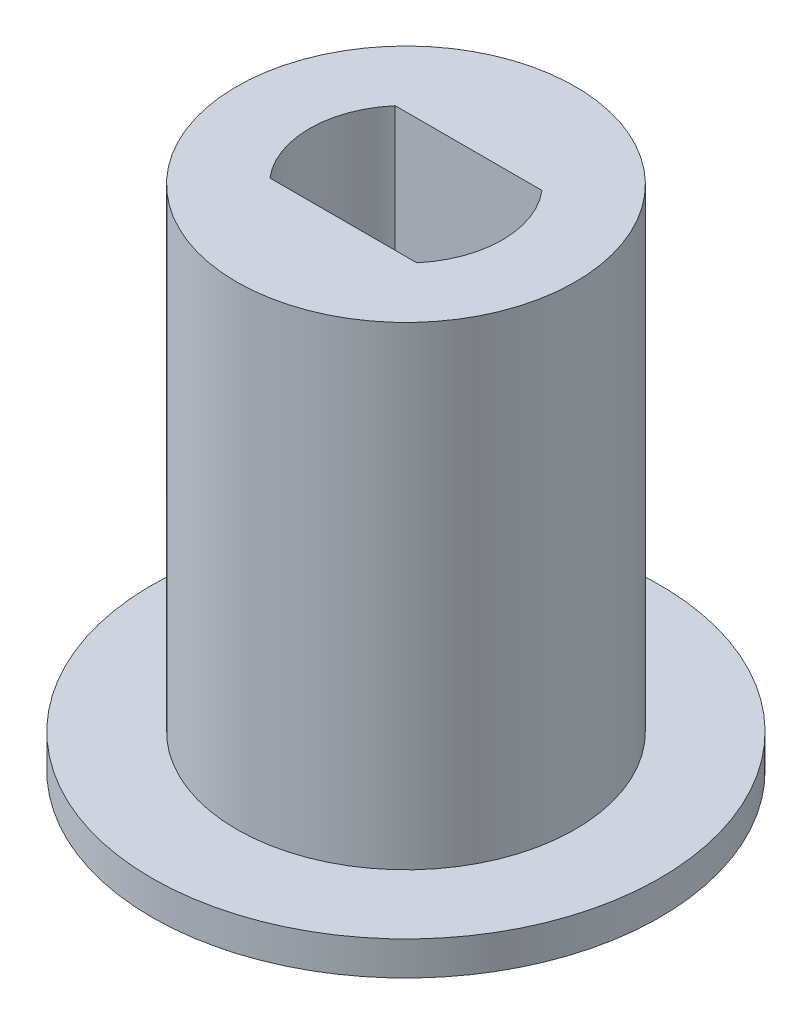
ISO-10303-21;
HEADER;
FILE_DESCRIPTION(('STEP AP214'),'2;1');
FILE_NAME('part.step','',(''),(''),'','','');
FILE_SCHEMA(('AUTOMOTIVE_DESIGN { 1 0 10303 214 1 1 1 1 }'));
ENDSEC;
DATA;
#1=APPLICATION_CONTEXT('core data for automotive mechanical design processes');
#2=APPLICATION_PROTOCOL_DEFINITION('international standard','automotive_design',2000,#1);
#3=PRODUCT_CONTEXT('',#1,'mechanical');
#4=PRODUCT('Part','Part','',(#3));
#5=PRODUCT_RELATED_PRODUCT_CATEGORY('part','',(#4));
#6=PRODUCT_DEFINITION_FORMATION('','',#4);
#7=PRODUCT_DEFINITION_CONTEXT('part definition',#1,'design');
#8=PRODUCT_DEFINITION('design','',#6,#7);
#9=PRODUCT_DEFINITION_SHAPE('','',#8);
#10=(LENGTH_UNIT() NAMED_UNIT(*) SI_UNIT(.MILLI.,.METRE.));
#11=(NAMED_UNIT(*) PLANE_ANGLE_UNIT() SI_UNIT($,.RADIAN.));
#12=(NAMED_UNIT(*) SI_UNIT($,.STERADIAN.) SOLID_ANGLE_UNIT());
#13=UNCERTAINTY_MEASURE_WITH_UNIT(LENGTH_MEASURE(1.E-05),#10,'distance_accuracy_value','');
#14=(GEOMETRIC_REPRESENTATION_CONTEXT(3) GLOBAL_UNCERTAINTY_ASSIGNED_CONTEXT((#13)) GLOBAL_UNIT_ASSIGNED_CONTEXT((#10,
#11,#12)) REPRESENTATION_CONTEXT('',''));
#15=CARTESIAN_POINT('',(0.,0.,0.));
#16=DIRECTION('',(0.,0.,1.));
#17=DIRECTION('',(1.,0.,0.));
#18=AXIS2_PLACEMENT_3D('',#15,#16,#17);
#19=CARTESIAN_POINT('',(0.,1.,0.));
#20=DIRECTION('',(0.,1.,0.));
#21=DIRECTION('',(0.,0.,1.));
#22=AXIS2_PLACEMENT_3D('',#19,#20,#21);
#23=PLANE('',#22);
#24=CARTESIAN_POINT('',(0.,1.,0.));
#25=DIRECTION('',(0.,1.,0.));
#26=DIRECTION('',(0.,0.,1.));
#27=AXIS2_PLACEMENT_3D('',#24,#25,#26);
#28=CIRCLE('',#27,5.);
#29=CARTESIAN_POINT('',(0.,1.,5.));
#30=VERTEX_POINT('',#29);
#31=EDGE_CURVE('E11',#30,#30,#28,.T.);
#32=ORIENTED_EDGE('',*,*,#31,.F.);
#33=EDGE_LOOP('',(#32));
#34=FACE_BOUND('',#33,.T.);
#35=CARTESIAN_POINT('',(0.,1.,0.));
#36=DIRECTION('',(0.,1.,0.));
#37=DIRECTION('',(0.,0.,1.));
#38=AXIS2_PLACEMENT_3D('',#35,#36,#37);
#39=CIRCLE('',#38,7.5);
#40=CARTESIAN_POINT('',(0.,1.,7.5));
#41=VERTEX_POINT('',#40);
#42=EDGE_CURVE('E132',#41,#41,#39,.T.);
#43=ORIENTED_EDGE('',*,*,#42,.T.);
#44=EDGE_LOOP('',(#43));
#45=FACE_BOUND('',#44,.T.);
#46=ADVANCED_FACE('F35',(#34,#45),#23,.T.);
#47=CARTESIAN_POINT('',(0.,0.,0.));
#48=DIRECTION('',(0.,1.,0.));
#49=DIRECTION('',(0.,0.,1.));
#50=AXIS2_PLACEMENT_3D('',#47,#48,#49);
#51=PLANE('',#50);
#52=CARTESIAN_POINT('',(0.,0.,0.));
#53=DIRECTION('',(0.,-1.,0.));
#54=DIRECTION('',(0.,0.,-1.));
#55=AXIS2_PLACEMENT_3D('',#52,#53,#54);
#56=CIRCLE('',#55,2.85);
#57=CARTESIAN_POINT('',(2.16794833886788,0.,-1.85));
#58=VERTEX_POINT('',#57);
#59=CARTESIAN_POINT('',(2.16794833886788,0.,1.85));
#60=VERTEX_POINT('',#59);
#61=EDGE_CURVE('E105',#58,#60,#56,.T.);
#62=ORIENTED_EDGE('',*,*,#61,.F.);
#63=DIRECTION('',(1.,0.,0.));
#64=VECTOR('',#63,1.);
#65=CARTESIAN_POINT('',(0.,0.,-1.85));
#66=LINE('',#65,#64);
#67=CARTESIAN_POINT('',(-2.16794833886788,0.,-1.85));
#68=VERTEX_POINT('',#67);
#69=EDGE_CURVE('E98',#68,#58,#66,.T.);
#70=ORIENTED_EDGE('',*,*,#69,.F.);
#71=CARTESIAN_POINT('',(0.,0.,0.));
#72=DIRECTION('',(0.,-1.,0.));
#73=DIRECTION('',(0.,0.,-1.));
#74=AXIS2_PLACEMENT_3D('',#71,#72,#73);
#75=CIRCLE('',#74,2.85);
#76=CARTESIAN_POINT('',(-2.16794833886788,0.,1.85));
#77=VERTEX_POINT('',#76);
#78=EDGE_CURVE('E87',#77,#68,#75,.T.);
#79=ORIENTED_EDGE('',*,*,#78,.F.);
#80=DIRECTION('',(-1.,0.,0.));
#81=VECTOR('',#80,1.);
#82=CARTESIAN_POINT('',(0.,0.,1.85));
#83=LINE('',#82,#81);
#84=EDGE_CURVE('E89',#60,#77,#83,.T.);
#85=ORIENTED_EDGE('',*,*,#84,.F.);
#86=EDGE_LOOP('',(#62,#70,#79,#85));
#87=FACE_BOUND('',#86,.T.);
#88=CARTESIAN_POINT('',(0.,0.,0.));
#89=DIRECTION('',(0.,1.,0.));
#90=DIRECTION('',(0.,0.,1.));
#91=AXIS2_PLACEMENT_3D('',#88,#89,#90);
#92=CIRCLE('',#91,7.5);
#93=CARTESIAN_POINT('',(0.,0.,7.5));
#94=VERTEX_POINT('',#93);
#95=EDGE_CURVE('E39',#94,#94,#92,.T.);
#96=ORIENTED_EDGE('',*,*,#95,.F.);
#97=EDGE_LOOP('',(#96));
#98=FACE_BOUND('',#97,.T.);
#99=ADVANCED_FACE('F37',(#87,#98),#51,.F.);
#100=CARTESIAN_POINT('',(0.,15.,0.));
#101=DIRECTION('',(0.,-1.,0.));
#102=DIRECTION('',(0.,0.,-1.));
#103=AXIS2_PLACEMENT_3D('',#100,#101,#102);
#104=CYLINDRICAL_SURFACE('',#103,5.);
#105=CARTESIAN_POINT('',(0.,15.,0.));
#106=DIRECTION('',(0.,1.,0.));
#107=DIRECTION('',(0.,0.,1.));
#108=AXIS2_PLACEMENT_3D('',#105,#106,#107);
#109=CIRCLE('',#108,5.);
#110=CARTESIAN_POINT('',(0.,15.,5.));
#111=VERTEX_POINT('',#110);
#112=EDGE_CURVE('E44',#111,#111,#109,.T.);
#113=ORIENTED_EDGE('',*,*,#112,.F.);
#114=EDGE_LOOP('',(#113));
#115=FACE_BOUND('',#114,.T.);
#116=ORIENTED_EDGE('',*,*,#31,.T.);
#117=EDGE_LOOP('',(#116));
#118=FACE_BOUND('',#117,.T.);
#119=ADVANCED_FACE('F122',(#115,#118),#104,.T.);
#120=CARTESIAN_POINT('',(0.,15.,0.));
#121=DIRECTION('',(0.,1.,0.));
#122=DIRECTION('',(0.,0.,1.));
#123=AXIS2_PLACEMENT_3D('',#120,#121,#122);
#124=PLANE('',#123);
#125=ORIENTED_EDGE('',*,*,#112,.T.);
#126=EDGE_LOOP('',(#125));
#127=FACE_BOUND('',#126,.T.);
#128=DIRECTION('',(1.,0.,0.));
#129=VECTOR('',#128,1.);
#130=CARTESIAN_POINT('',(0.,15.,-1.85));
#131=LINE('',#130,#129);
#132=CARTESIAN_POINT('',(-2.16794833886788,15.,-1.85));
#133=VERTEX_POINT('',#132);
#134=CARTESIAN_POINT('',(2.16794833886788,15.,-1.85));
#135=VERTEX_POINT('',#134);
#136=EDGE_CURVE('E104',#133,#135,#131,.T.);
#137=ORIENTED_EDGE('',*,*,#136,.T.);
#138=CARTESIAN_POINT('',(0.,15.,0.));
#139=DIRECTION('',(0.,1.,0.));
#140=DIRECTION('',(0.,0.,1.));
#141=AXIS2_PLACEMENT_3D('',#138,#139,#140);
#142=CIRCLE('',#141,2.85);
#143=CARTESIAN_POINT('',(2.16794833886788,15.,1.85));
#144=VERTEX_POINT('',#143);
#145=EDGE_CURVE('E109',#135,#144,#142,.F.);
#146=ORIENTED_EDGE('',*,*,#145,.T.);
#147=DIRECTION('',(-1.,0.,0.));
#148=VECTOR('',#147,1.);
#149=CARTESIAN_POINT('',(0.,15.,1.85));
#150=LINE('',#149,#148);
#151=CARTESIAN_POINT('',(-2.16794833886788,15.,1.85));
#152=VERTEX_POINT('',#151);
#153=EDGE_CURVE('E74',#144,#152,#150,.T.);
#154=ORIENTED_EDGE('',*,*,#153,.T.);
#155=CARTESIAN_POINT('',(0.,15.,0.));
#156=DIRECTION('',(0.,1.,0.));
#157=DIRECTION('',(0.,0.,1.));
#158=AXIS2_PLACEMENT_3D('',#155,#156,#157);
#159=CIRCLE('',#158,2.85);
#160=EDGE_CURVE('E82',#152,#133,#159,.F.);
#161=ORIENTED_EDGE('',*,*,#160,.T.);
#162=EDGE_LOOP('',(#137,#146,#154,#161));
#163=FACE_BOUND('',#162,.T.);
#164=ADVANCED_FACE('F119',(#127,#163),#124,.T.);
#165=CARTESIAN_POINT('',(0.,22.211102550928,0.));
#166=DIRECTION('',(0.,-1.,0.));
#167=DIRECTION('',(0.,0.,-1.));
#168=AXIS2_PLACEMENT_3D('',#165,#166,#167);
#169=CYLINDRICAL_SURFACE('',#168,2.85);
#170=ORIENTED_EDGE('',*,*,#145,.F.);
#171=DIRECTION('',(0.,-1.,0.));
#172=VECTOR('',#171,1.);
#173=CARTESIAN_POINT('',(2.16794833886788,22.211102550928,-1.85));
#174=LINE('',#173,#172);
#175=EDGE_CURVE('E51',#135,#58,#174,.T.);
#176=ORIENTED_EDGE('',*,*,#175,.T.);
#177=ORIENTED_EDGE('',*,*,#61,.T.);
#178=DIRECTION('',(0.,-1.,0.));
#179=VECTOR('',#178,1.);
#180=CARTESIAN_POINT('',(2.16794833886788,22.211102550928,1.85));
#181=LINE('',#180,#179);
#182=EDGE_CURVE('E93',#144,#60,#181,.T.);
#183=ORIENTED_EDGE('',*,*,#182,.F.);
#184=EDGE_LOOP('',(#170,#176,#177,#183));
#185=FACE_BOUND('',#184,.T.);
#186=ADVANCED_FACE('F154',(#185),#169,.F.);
#187=CARTESIAN_POINT('',(0.,22.211102550928,1.85));
#188=DIRECTION('',(0.,0.,1.));
#189=DIRECTION('',(1.,0.,0.));
#190=AXIS2_PLACEMENT_3D('',#187,#188,#189);
#191=PLANE('',#190);
#192=ORIENTED_EDGE('',*,*,#153,.F.);
#193=ORIENTED_EDGE('',*,*,#182,.T.);
#194=ORIENTED_EDGE('',*,*,#84,.T.);
#195=DIRECTION('',(0.,-1.,0.));
#196=VECTOR('',#195,1.);
#197=CARTESIAN_POINT('',(-2.16794833886788,22.211102550928,1.85));
#198=LINE('',#197,#196);
#199=EDGE_CURVE('E83',#152,#77,#198,.T.);
#200=ORIENTED_EDGE('',*,*,#199,.F.);
#201=EDGE_LOOP('',(#192,#193,#194,#200));
#202=FACE_BOUND('',#201,.T.);
#203=ADVANCED_FACE('F92',(#202),#191,.F.);
#204=CARTESIAN_POINT('',(0.,22.211102550928,0.));
#205=DIRECTION('',(0.,-1.,0.));
#206=DIRECTION('',(0.,0.,-1.));
#207=AXIS2_PLACEMENT_3D('',#204,#205,#206);
#208=CYLINDRICAL_SURFACE('',#207,2.85);
#209=ORIENTED_EDGE('',*,*,#160,.F.);
#210=ORIENTED_EDGE('',*,*,#199,.T.);
#211=ORIENTED_EDGE('',*,*,#78,.T.);
#212=DIRECTION('',(0.,-1.,0.));
#213=VECTOR('',#212,1.);
#214=CARTESIAN_POINT('',(-2.16794833886788,22.211102550928,-1.85));
#215=LINE('',#214,#213);
#216=EDGE_CURVE('E57',#133,#68,#215,.T.);
#217=ORIENTED_EDGE('',*,*,#216,.F.);
#218=EDGE_LOOP('',(#209,#210,#211,#217));
#219=FACE_BOUND('',#218,.T.);
#220=ADVANCED_FACE('F85',(#219),#208,.F.);
#221=CARTESIAN_POINT('',(0.,22.211102550928,-1.85));
#222=DIRECTION('',(0.,0.,-1.));
#223=DIRECTION('',(-1.,0.,0.));
#224=AXIS2_PLACEMENT_3D('',#221,#222,#223);
#225=PLANE('',#224);
#226=ORIENTED_EDGE('',*,*,#136,.F.);
#227=ORIENTED_EDGE('',*,*,#216,.T.);
#228=ORIENTED_EDGE('',*,*,#69,.T.);
#229=ORIENTED_EDGE('',*,*,#175,.F.);
#230=EDGE_LOOP('',(#226,#227,#228,#229));
#231=FACE_BOUND('',#230,.T.);
#232=ADVANCED_FACE('F173',(#231),#225,.F.);
#233=CARTESIAN_POINT('',(0.,-9.,0.));
#234=DIRECTION('',(0.,1.,0.));
#235=DIRECTION('',(0.,0.,1.));
#236=AXIS2_PLACEMENT_3D('',#233,#234,#235);
#237=CYLINDRICAL_SURFACE('',#236,7.5);
#238=ORIENTED_EDGE('',*,*,#42,.F.);
#239=EDGE_LOOP('',(#238));
#240=FACE_BOUND('',#239,.T.);
#241=ORIENTED_EDGE('',*,*,#95,.T.);
#242=EDGE_LOOP('',(#241));
#243=FACE_BOUND('',#242,.T.);
#244=ADVANCED_FACE('F137',(#240,#243),#237,.T.);
#245=CLOSED_SHELL('',(#46,#99,#119,#164,#186,#203,#220,#232,#244));
#246=MANIFOLD_SOLID_BREP('B2',#245);
#247=ADVANCED_BREP_SHAPE_REPRESENTATION('',(#18,#246),#14);
#248=SHAPE_DEFINITION_REPRESENTATION(#9,#247);
ENDSEC;
END-ISO-10303-21;
